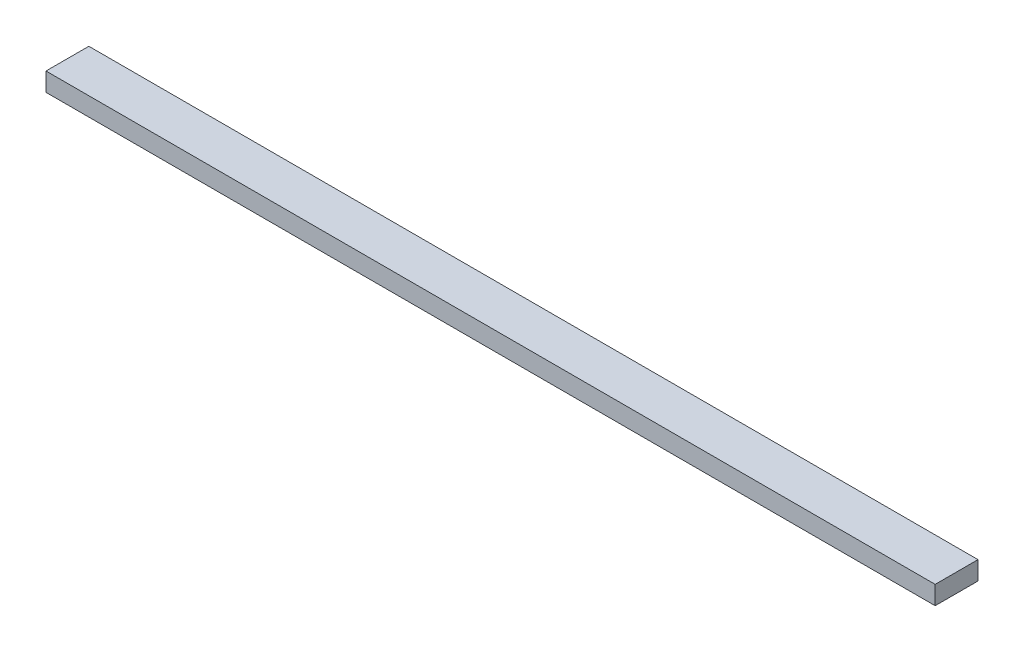
ISO-10303-21;
HEADER;
FILE_DESCRIPTION(('STEP AP214'),'2;1');
FILE_NAME('part.step','',(''),(''),'','','');
FILE_SCHEMA(('AUTOMOTIVE_DESIGN { 1 0 10303 214 1 1 1 1 }'));
ENDSEC;
DATA;
#1=APPLICATION_CONTEXT('core data for automotive mechanical design processes');
#2=APPLICATION_PROTOCOL_DEFINITION('international standard','automotive_design',2000,#1);
#3=PRODUCT_CONTEXT('',#1,'mechanical');
#4=PRODUCT('Part','Part','',(#3));
#5=PRODUCT_RELATED_PRODUCT_CATEGORY('part','',(#4));
#6=PRODUCT_DEFINITION_FORMATION('','',#4);
#7=PRODUCT_DEFINITION_CONTEXT('part definition',#1,'design');
#8=PRODUCT_DEFINITION('design','',#6,#7);
#9=PRODUCT_DEFINITION_SHAPE('','',#8);
#10=(LENGTH_UNIT() NAMED_UNIT(*) SI_UNIT(.MILLI.,.METRE.));
#11=(NAMED_UNIT(*) PLANE_ANGLE_UNIT() SI_UNIT($,.RADIAN.));
#12=(NAMED_UNIT(*) SI_UNIT($,.STERADIAN.) SOLID_ANGLE_UNIT());
#13=UNCERTAINTY_MEASURE_WITH_UNIT(LENGTH_MEASURE(1.E-05),#10,'distance_accuracy_value','');
#14=(GEOMETRIC_REPRESENTATION_CONTEXT(3) GLOBAL_UNCERTAINTY_ASSIGNED_CONTEXT((#13)) GLOBAL_UNIT_ASSIGNED_CONTEXT((#10,
#11,#12)) REPRESENTATION_CONTEXT('',''));
#15=CARTESIAN_POINT('',(0.,0.,0.));
#16=DIRECTION('',(0.,0.,1.));
#17=DIRECTION('',(1.,0.,0.));
#18=AXIS2_PLACEMENT_3D('',#15,#16,#17);
#19=CARTESIAN_POINT('',(1924.79125631568,-19.05,44.053125));
#20=DIRECTION('',(0.,0.,-1.));
#21=DIRECTION('',(-1.,0.,0.));
#22=AXIS2_PLACEMENT_3D('',#19,#20,#21);
#23=PLANE('',#22);
#24=DIRECTION('',(0.,-1.,0.));
#25=VECTOR('',#24,1.);
#26=CARTESIAN_POINT('',(1828.8,-19.05,44.053125));
#27=LINE('',#26,#25);
#28=CARTESIAN_POINT('',(1828.8,19.05,44.053125));
#29=VERTEX_POINT('',#28);
#30=CARTESIAN_POINT('',(1828.8,-19.05,44.053125));
#31=VERTEX_POINT('',#30);
#32=EDGE_CURVE('E82',#29,#31,#27,.T.);
#33=ORIENTED_EDGE('',*,*,#32,.F.);
#34=DIRECTION('',(-1.,0.,0.));
#35=VECTOR('',#34,1.);
#36=CARTESIAN_POINT('',(1924.79125631568,19.05,44.053125));
#37=LINE('',#36,#35);
#38=CARTESIAN_POINT('',(0.,19.05,44.053125));
#39=VERTEX_POINT('',#38);
#40=EDGE_CURVE('E36',#29,#39,#37,.T.);
#41=ORIENTED_EDGE('',*,*,#40,.T.);
#42=DIRECTION('',(0.,-1.,0.));
#43=VECTOR('',#42,1.);
#44=CARTESIAN_POINT('',(0.,-19.05,44.053125));
#45=LINE('',#44,#43);
#46=CARTESIAN_POINT('',(0.,-19.05,44.053125));
#47=VERTEX_POINT('',#46);
#48=EDGE_CURVE('E80',#39,#47,#45,.T.);
#49=ORIENTED_EDGE('',*,*,#48,.T.);
#50=DIRECTION('',(-1.,0.,0.));
#51=VECTOR('',#50,1.);
#52=CARTESIAN_POINT('',(1924.79125631568,-19.05,44.053125));
#53=LINE('',#52,#51);
#54=EDGE_CURVE('E71',#31,#47,#53,.T.);
#55=ORIENTED_EDGE('',*,*,#54,.F.);
#56=EDGE_LOOP('',(#33,#41,#49,#55));
#57=FACE_BOUND('',#56,.T.);
#58=ADVANCED_FACE('F32',(#57),#23,.F.);
#59=CARTESIAN_POINT('',(1924.79125631568,-19.05,-44.053125));
#60=DIRECTION('',(0.,1.,0.));
#61=DIRECTION('',(0.,0.,1.));
#62=AXIS2_PLACEMENT_3D('',#59,#60,#61);
#63=PLANE('',#62);
#64=DIRECTION('',(0.,0.,-1.));
#65=VECTOR('',#64,1.);
#66=CARTESIAN_POINT('',(1828.8,-19.05,-44.053125));
#67=LINE('',#66,#65);
#68=CARTESIAN_POINT('',(1828.8,-19.05,-44.053125));
#69=VERTEX_POINT('',#68);
#70=EDGE_CURVE('E41',#31,#69,#67,.T.);
#71=ORIENTED_EDGE('',*,*,#70,.F.);
#72=ORIENTED_EDGE('',*,*,#54,.T.);
#73=DIRECTION('',(0.,0.,-1.));
#74=VECTOR('',#73,1.);
#75=CARTESIAN_POINT('',(0.,-19.05,-44.053125));
#76=LINE('',#75,#74);
#77=CARTESIAN_POINT('',(0.,-19.05,-44.053125));
#78=VERTEX_POINT('',#77);
#79=EDGE_CURVE('E92',#47,#78,#76,.T.);
#80=ORIENTED_EDGE('',*,*,#79,.T.);
#81=DIRECTION('',(-1.,0.,0.));
#82=VECTOR('',#81,1.);
#83=CARTESIAN_POINT('',(1924.79125631568,-19.05,-44.053125));
#84=LINE('',#83,#82);
#85=EDGE_CURVE('E101',#69,#78,#84,.T.);
#86=ORIENTED_EDGE('',*,*,#85,.F.);
#87=EDGE_LOOP('',(#71,#72,#80,#86));
#88=FACE_BOUND('',#87,.T.);
#89=ADVANCED_FACE('F105',(#88),#63,.F.);
#90=CARTESIAN_POINT('',(1924.79125631568,-19.05,-44.053125));
#91=DIRECTION('',(0.,0.,1.));
#92=DIRECTION('',(1.,0.,0.));
#93=AXIS2_PLACEMENT_3D('',#90,#91,#92);
#94=PLANE('',#93);
#95=DIRECTION('',(0.,1.,0.));
#96=VECTOR('',#95,1.);
#97=CARTESIAN_POINT('',(1828.8,-19.05,-44.053125));
#98=LINE('',#97,#96);
#99=CARTESIAN_POINT('',(1828.8,19.05,-44.053125));
#100=VERTEX_POINT('',#99);
#101=EDGE_CURVE('E11',#69,#100,#98,.T.);
#102=ORIENTED_EDGE('',*,*,#101,.F.);
#103=ORIENTED_EDGE('',*,*,#85,.T.);
#104=DIRECTION('',(0.,1.,0.));
#105=VECTOR('',#104,1.);
#106=CARTESIAN_POINT('',(0.,-19.05,-44.053125));
#107=LINE('',#106,#105);
#108=CARTESIAN_POINT('',(0.,19.05,-44.053125));
#109=VERTEX_POINT('',#108);
#110=EDGE_CURVE('E102',#78,#109,#107,.T.);
#111=ORIENTED_EDGE('',*,*,#110,.T.);
#112=DIRECTION('',(-1.,0.,0.));
#113=VECTOR('',#112,1.);
#114=CARTESIAN_POINT('',(1924.79125631568,19.05,-44.053125));
#115=LINE('',#114,#113);
#116=EDGE_CURVE('E54',#100,#109,#115,.T.);
#117=ORIENTED_EDGE('',*,*,#116,.F.);
#118=EDGE_LOOP('',(#102,#103,#111,#117));
#119=FACE_BOUND('',#118,.T.);
#120=ADVANCED_FACE('F104',(#119),#94,.F.);
#121=CARTESIAN_POINT('',(1924.79125631568,19.05,-44.053125));
#122=DIRECTION('',(0.,-1.,0.));
#123=DIRECTION('',(0.,0.,-1.));
#124=AXIS2_PLACEMENT_3D('',#121,#122,#123);
#125=PLANE('',#124);
#126=DIRECTION('',(0.,0.,1.));
#127=VECTOR('',#126,1.);
#128=CARTESIAN_POINT('',(1828.8,19.05,-44.053125));
#129=LINE('',#128,#127);
#130=EDGE_CURVE('E89',#100,#29,#129,.T.);
#131=ORIENTED_EDGE('',*,*,#130,.F.);
#132=ORIENTED_EDGE('',*,*,#116,.T.);
#133=DIRECTION('',(0.,0.,1.));
#134=VECTOR('',#133,1.);
#135=CARTESIAN_POINT('',(0.,19.05,-44.053125));
#136=LINE('',#135,#134);
#137=EDGE_CURVE('E85',#109,#39,#136,.T.);
#138=ORIENTED_EDGE('',*,*,#137,.T.);
#139=ORIENTED_EDGE('',*,*,#40,.F.);
#140=EDGE_LOOP('',(#131,#132,#138,#139));
#141=FACE_BOUND('',#140,.T.);
#142=ADVANCED_FACE('F86',(#141),#125,.F.);
#143=CARTESIAN_POINT('',(0.,0.,0.));
#144=DIRECTION('',(1.,0.,0.));
#145=DIRECTION('',(0.,0.,-1.));
#146=AXIS2_PLACEMENT_3D('',#143,#144,#145);
#147=PLANE('',#146);
#148=ORIENTED_EDGE('',*,*,#48,.F.);
#149=ORIENTED_EDGE('',*,*,#137,.F.);
#150=ORIENTED_EDGE('',*,*,#110,.F.);
#151=ORIENTED_EDGE('',*,*,#79,.F.);
#152=EDGE_LOOP('',(#148,#149,#150,#151));
#153=FACE_BOUND('',#152,.T.);
#154=ADVANCED_FACE('F91',(#153),#147,.F.);
#155=CARTESIAN_POINT('',(1828.8,209.55,966.338131315679));
#156=DIRECTION('',(1.,0.,0.));
#157=DIRECTION('',(0.,0.,-1.));
#158=AXIS2_PLACEMENT_3D('',#155,#156,#157);
#159=PLANE('',#158);
#160=ORIENTED_EDGE('',*,*,#130,.T.);
#161=ORIENTED_EDGE('',*,*,#32,.T.);
#162=ORIENTED_EDGE('',*,*,#70,.T.);
#163=ORIENTED_EDGE('',*,*,#101,.T.);
#164=EDGE_LOOP('',(#160,#161,#162,#163));
#165=FACE_BOUND('',#164,.T.);
#166=ADVANCED_FACE('F34',(#165),#159,.T.);
#167=CLOSED_SHELL('',(#58,#89,#120,#142,#154,#166));
#168=MANIFOLD_SOLID_BREP('B2',#167);
#169=ADVANCED_BREP_SHAPE_REPRESENTATION('',(#18,#168),#14);
#170=SHAPE_DEFINITION_REPRESENTATION(#9,#169);
ENDSEC;
END-ISO-10303-21;
